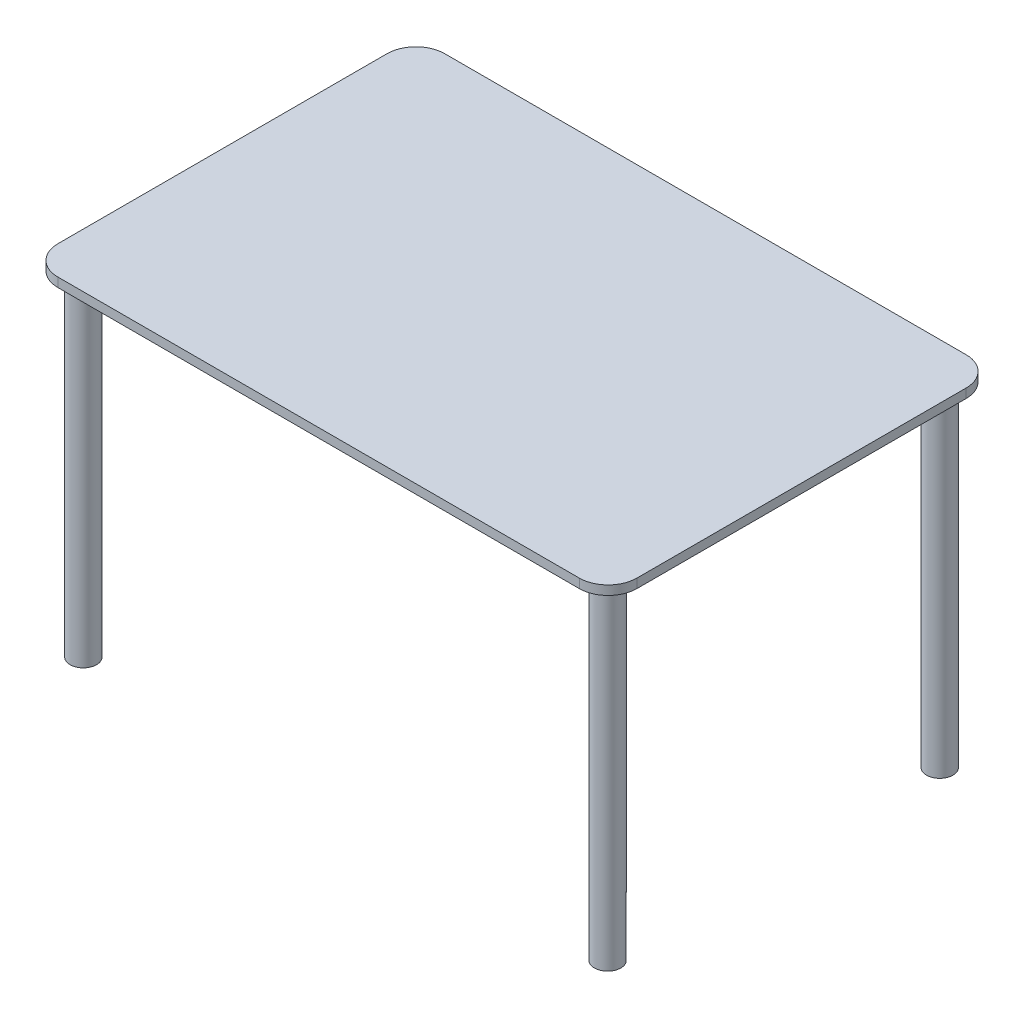
ISO-10303-21;
HEADER;
FILE_DESCRIPTION(('STEP AP214'),'2;1');
FILE_NAME('part.step','',(''),(''),'','','');
FILE_SCHEMA(('AUTOMOTIVE_DESIGN { 1 0 10303 214 1 1 1 1 }'));
ENDSEC;
DATA;
#1=APPLICATION_CONTEXT('core data for automotive mechanical design processes');
#2=APPLICATION_PROTOCOL_DEFINITION('international standard','automotive_design',2000,#1);
#3=PRODUCT_CONTEXT('',#1,'mechanical');
#4=PRODUCT('Part','Part','',(#3));
#5=PRODUCT_RELATED_PRODUCT_CATEGORY('part','',(#4));
#6=PRODUCT_DEFINITION_FORMATION('','',#4);
#7=PRODUCT_DEFINITION_CONTEXT('part definition',#1,'design');
#8=PRODUCT_DEFINITION('design','',#6,#7);
#9=PRODUCT_DEFINITION_SHAPE('','',#8);
#10=(LENGTH_UNIT() NAMED_UNIT(*) SI_UNIT(.MILLI.,.METRE.));
#11=(NAMED_UNIT(*) PLANE_ANGLE_UNIT() SI_UNIT($,.RADIAN.));
#12=(NAMED_UNIT(*) SI_UNIT($,.STERADIAN.) SOLID_ANGLE_UNIT());
#13=UNCERTAINTY_MEASURE_WITH_UNIT(LENGTH_MEASURE(1.E-05),#10,'distance_accuracy_value','');
#14=(GEOMETRIC_REPRESENTATION_CONTEXT(3) GLOBAL_UNCERTAINTY_ASSIGNED_CONTEXT((#13)) GLOBAL_UNIT_ASSIGNED_CONTEXT((#10,
#11,#12)) REPRESENTATION_CONTEXT('',''));
#15=CARTESIAN_POINT('',(0.,0.,0.));
#16=DIRECTION('',(0.,0.,1.));
#17=DIRECTION('',(1.,0.,0.));
#18=AXIS2_PLACEMENT_3D('',#15,#16,#17);
#19=CARTESIAN_POINT('',(-602.5,19.,-402.5));
#20=DIRECTION('',(0.,0.,-1.));
#21=DIRECTION('',(-1.,0.,0.));
#22=AXIS2_PLACEMENT_3D('',#19,#20,#21);
#23=PLANE('',#22);
#24=DIRECTION('',(1.,0.,0.));
#25=VECTOR('',#24,1.);
#26=CARTESIAN_POINT('',(-602.5,0.,-402.5));
#27=LINE('',#26,#25);
#28=CARTESIAN_POINT('',(-542.5,0.,-402.5));
#29=VERTEX_POINT('',#28);
#30=CARTESIAN_POINT('',(542.5,0.,-402.5));
#31=VERTEX_POINT('',#30);
#32=EDGE_CURVE('E136',#29,#31,#27,.T.);
#33=ORIENTED_EDGE('',*,*,#32,.F.);
#34=DIRECTION('',(0.,-1.,0.));
#35=VECTOR('',#34,1.);
#36=CARTESIAN_POINT('',(-542.5,19.,-402.5));
#37=LINE('',#36,#35);
#38=CARTESIAN_POINT('',(-542.5,19.,-402.5));
#39=VERTEX_POINT('',#38);
#40=EDGE_CURVE('E11',#29,#39,#37,.F.);
#41=ORIENTED_EDGE('',*,*,#40,.T.);
#42=DIRECTION('',(1.,0.,0.));
#43=VECTOR('',#42,1.);
#44=CARTESIAN_POINT('',(-602.5,19.,-402.5));
#45=LINE('',#44,#43);
#46=CARTESIAN_POINT('',(542.5,19.,-402.5));
#47=VERTEX_POINT('',#46);
#48=EDGE_CURVE('E149',#39,#47,#45,.T.);
#49=ORIENTED_EDGE('',*,*,#48,.T.);
#50=DIRECTION('',(0.,-1.,0.));
#51=VECTOR('',#50,1.);
#52=CARTESIAN_POINT('',(542.5,0.,-402.5));
#53=LINE('',#52,#51);
#54=EDGE_CURVE('E48',#47,#31,#53,.T.);
#55=ORIENTED_EDGE('',*,*,#54,.T.);
#56=EDGE_LOOP('',(#33,#41,#49,#55));
#57=FACE_BOUND('',#56,.T.);
#58=ADVANCED_FACE('F39',(#57),#23,.T.);
#59=CARTESIAN_POINT('',(-602.5,19.,402.5));
#60=DIRECTION('',(-1.,0.,0.));
#61=DIRECTION('',(0.,0.,1.));
#62=AXIS2_PLACEMENT_3D('',#59,#60,#61);
#63=PLANE('',#62);
#64=DIRECTION('',(0.,0.,-1.));
#65=VECTOR('',#64,1.);
#66=CARTESIAN_POINT('',(-602.5,0.,402.5));
#67=LINE('',#66,#65);
#68=CARTESIAN_POINT('',(-602.5,0.,342.5));
#69=VERTEX_POINT('',#68);
#70=CARTESIAN_POINT('',(-602.5,0.,-342.5));
#71=VERTEX_POINT('',#70);
#72=EDGE_CURVE('E140',#69,#71,#67,.T.);
#73=ORIENTED_EDGE('',*,*,#72,.F.);
#74=DIRECTION('',(0.,-1.,0.));
#75=VECTOR('',#74,1.);
#76=CARTESIAN_POINT('',(-602.5,19.,342.5));
#77=LINE('',#76,#75);
#78=CARTESIAN_POINT('',(-602.5,19.,342.5));
#79=VERTEX_POINT('',#78);
#80=EDGE_CURVE('E62',#69,#79,#77,.F.);
#81=ORIENTED_EDGE('',*,*,#80,.T.);
#82=DIRECTION('',(0.,0.,-1.));
#83=VECTOR('',#82,1.);
#84=CARTESIAN_POINT('',(-602.5,19.,402.5));
#85=LINE('',#84,#83);
#86=CARTESIAN_POINT('',(-602.5,19.,-342.5));
#87=VERTEX_POINT('',#86);
#88=EDGE_CURVE('E155',#79,#87,#85,.T.);
#89=ORIENTED_EDGE('',*,*,#88,.T.);
#90=DIRECTION('',(0.,-1.,0.));
#91=VECTOR('',#90,1.);
#92=CARTESIAN_POINT('',(-602.5,19.,-342.5));
#93=LINE('',#92,#91);
#94=EDGE_CURVE('E192',#87,#71,#93,.T.);
#95=ORIENTED_EDGE('',*,*,#94,.T.);
#96=EDGE_LOOP('',(#73,#81,#89,#95));
#97=FACE_BOUND('',#96,.T.);
#98=ADVANCED_FACE('F209',(#97),#63,.T.);
#99=CARTESIAN_POINT('',(-602.5,19.,402.5));
#100=DIRECTION('',(0.,0.,-1.));
#101=DIRECTION('',(-1.,0.,0.));
#102=AXIS2_PLACEMENT_3D('',#99,#100,#101);
#103=PLANE('',#102);
#104=DIRECTION('',(1.,0.,0.));
#105=VECTOR('',#104,1.);
#106=CARTESIAN_POINT('',(-602.5,0.,402.5));
#107=LINE('',#106,#105);
#108=CARTESIAN_POINT('',(-542.5,0.,402.5));
#109=VERTEX_POINT('',#108);
#110=CARTESIAN_POINT('',(542.5,0.,402.5));
#111=VERTEX_POINT('',#110);
#112=EDGE_CURVE('E135',#109,#111,#107,.T.);
#113=ORIENTED_EDGE('',*,*,#112,.T.);
#114=DIRECTION('',(0.,-1.,0.));
#115=VECTOR('',#114,1.);
#116=CARTESIAN_POINT('',(542.5,19.,402.5));
#117=LINE('',#116,#115);
#118=CARTESIAN_POINT('',(542.5,19.,402.5));
#119=VERTEX_POINT('',#118);
#120=EDGE_CURVE('E111',#111,#119,#117,.F.);
#121=ORIENTED_EDGE('',*,*,#120,.T.);
#122=DIRECTION('',(1.,0.,0.));
#123=VECTOR('',#122,1.);
#124=CARTESIAN_POINT('',(-602.5,19.,402.5));
#125=LINE('',#124,#123);
#126=CARTESIAN_POINT('',(-542.5,19.,402.5));
#127=VERTEX_POINT('',#126);
#128=EDGE_CURVE('E212',#127,#119,#125,.T.);
#129=ORIENTED_EDGE('',*,*,#128,.F.);
#130=DIRECTION('',(0.,-1.,0.));
#131=VECTOR('',#130,1.);
#132=CARTESIAN_POINT('',(-542.5,0.,402.5));
#133=LINE('',#132,#131);
#134=EDGE_CURVE('E117',#127,#109,#133,.T.);
#135=ORIENTED_EDGE('',*,*,#134,.T.);
#136=EDGE_LOOP('',(#113,#121,#129,#135));
#137=FACE_BOUND('',#136,.T.);
#138=ADVANCED_FACE('F274',(#137),#103,.F.);
#139=CARTESIAN_POINT('',(602.5,19.,402.5));
#140=DIRECTION('',(-1.,0.,0.));
#141=DIRECTION('',(0.,0.,1.));
#142=AXIS2_PLACEMENT_3D('',#139,#140,#141);
#143=PLANE('',#142);
#144=DIRECTION('',(0.,0.,-1.));
#145=VECTOR('',#144,1.);
#146=CARTESIAN_POINT('',(602.5,19.,402.5));
#147=LINE('',#146,#145);
#148=CARTESIAN_POINT('',(602.5,19.,342.5));
#149=VERTEX_POINT('',#148);
#150=CARTESIAN_POINT('',(602.5,19.,-342.5));
#151=VERTEX_POINT('',#150);
#152=EDGE_CURVE('E127',#149,#151,#147,.T.);
#153=ORIENTED_EDGE('',*,*,#152,.F.);
#154=DIRECTION('',(0.,-1.,0.));
#155=VECTOR('',#154,1.);
#156=CARTESIAN_POINT('',(602.5,19.,342.5));
#157=LINE('',#156,#155);
#158=CARTESIAN_POINT('',(602.5,0.,342.5));
#159=VERTEX_POINT('',#158);
#160=EDGE_CURVE('E110',#149,#159,#157,.T.);
#161=ORIENTED_EDGE('',*,*,#160,.T.);
#162=DIRECTION('',(0.,0.,-1.));
#163=VECTOR('',#162,1.);
#164=CARTESIAN_POINT('',(602.5,0.,402.5));
#165=LINE('',#164,#163);
#166=CARTESIAN_POINT('',(602.5,0.,-342.5));
#167=VERTEX_POINT('',#166);
#168=EDGE_CURVE('E124',#159,#167,#165,.T.);
#169=ORIENTED_EDGE('',*,*,#168,.T.);
#170=DIRECTION('',(0.,-1.,0.));
#171=VECTOR('',#170,1.);
#172=CARTESIAN_POINT('',(602.5,19.,-342.5));
#173=LINE('',#172,#171);
#174=EDGE_CURVE('E130',#167,#151,#173,.F.);
#175=ORIENTED_EDGE('',*,*,#174,.T.);
#176=EDGE_LOOP('',(#153,#161,#169,#175));
#177=FACE_BOUND('',#176,.T.);
#178=ADVANCED_FACE('F123',(#177),#143,.F.);
#179=CARTESIAN_POINT('',(0.,19.,0.));
#180=DIRECTION('',(0.,1.,0.));
#181=DIRECTION('',(0.,0.,1.));
#182=AXIS2_PLACEMENT_3D('',#179,#180,#181);
#183=PLANE('',#182);
#184=ORIENTED_EDGE('',*,*,#128,.T.);
#185=CARTESIAN_POINT('',(542.5,19.,342.5));
#186=DIRECTION('',(0.,1.,0.));
#187=DIRECTION('',(0.,0.,1.));
#188=AXIS2_PLACEMENT_3D('',#185,#186,#187);
#189=CIRCLE('',#188,60.);
#190=EDGE_CURVE('E189',#119,#149,#189,.T.);
#191=ORIENTED_EDGE('',*,*,#190,.T.);
#192=ORIENTED_EDGE('',*,*,#152,.T.);
#193=CARTESIAN_POINT('',(542.5,19.,-342.5));
#194=DIRECTION('',(0.,1.,0.));
#195=DIRECTION('',(0.,0.,1.));
#196=AXIS2_PLACEMENT_3D('',#193,#194,#195);
#197=CIRCLE('',#196,60.);
#198=EDGE_CURVE('E181',#151,#47,#197,.T.);
#199=ORIENTED_EDGE('',*,*,#198,.T.);
#200=ORIENTED_EDGE('',*,*,#48,.F.);
#201=CARTESIAN_POINT('',(-542.5,19.,-342.5));
#202=DIRECTION('',(0.,1.,0.));
#203=DIRECTION('',(0.,0.,1.));
#204=AXIS2_PLACEMENT_3D('',#201,#202,#203);
#205=CIRCLE('',#204,60.);
#206=EDGE_CURVE('E55',#39,#87,#205,.T.);
#207=ORIENTED_EDGE('',*,*,#206,.T.);
#208=ORIENTED_EDGE('',*,*,#88,.F.);
#209=CARTESIAN_POINT('',(-542.5,19.,342.5));
#210=DIRECTION('',(0.,1.,0.));
#211=DIRECTION('',(0.,0.,1.));
#212=AXIS2_PLACEMENT_3D('',#209,#210,#211);
#213=CIRCLE('',#212,60.);
#214=EDGE_CURVE('E186',#79,#127,#213,.T.);
#215=ORIENTED_EDGE('',*,*,#214,.T.);
#216=EDGE_LOOP('',(#184,#191,#192,#199,#200,#207,#208,#215));
#217=FACE_BOUND('',#216,.T.);
#218=ADVANCED_FACE('F249',(#217),#183,.T.);
#219=CARTESIAN_POINT('',(0.,0.,0.));
#220=DIRECTION('',(0.,1.,0.));
#221=DIRECTION('',(0.,0.,1.));
#222=AXIS2_PLACEMENT_3D('',#219,#220,#221);
#223=PLANE('',#222);
#224=CARTESIAN_POINT('',(-546.,0.,-346.));
#225=DIRECTION('',(0.,1.,0.));
#226=DIRECTION('',(0.,0.,1.));
#227=AXIS2_PLACEMENT_3D('',#224,#225,#226);
#228=CIRCLE('',#227,27.5);
#229=CARTESIAN_POINT('',(-546.,0.,-318.5));
#230=VERTEX_POINT('',#229);
#231=EDGE_CURVE('E163',#230,#230,#228,.F.);
#232=ORIENTED_EDGE('',*,*,#231,.F.);
#233=EDGE_LOOP('',(#232));
#234=FACE_BOUND('',#233,.T.);
#235=CARTESIAN_POINT('',(544.120521211834,0.,-346.));
#236=DIRECTION('',(0.,1.,0.));
#237=DIRECTION('',(0.,0.,1.));
#238=AXIS2_PLACEMENT_3D('',#235,#236,#237);
#239=CIRCLE('',#238,27.4999999999999);
#240=CARTESIAN_POINT('',(544.120521211834,0.,-318.5));
#241=VERTEX_POINT('',#240);
#242=EDGE_CURVE('E159',#241,#241,#239,.F.);
#243=ORIENTED_EDGE('',*,*,#242,.F.);
#244=EDGE_LOOP('',(#243));
#245=FACE_BOUND('',#244,.T.);
#246=CARTESIAN_POINT('',(546.,0.,347.089225584359));
#247=DIRECTION('',(0.,1.,0.));
#248=DIRECTION('',(0.,0.,1.));
#249=AXIS2_PLACEMENT_3D('',#246,#247,#248);
#250=CIRCLE('',#249,27.4999999999999);
#251=CARTESIAN_POINT('',(546.,0.,374.589225584359));
#252=VERTEX_POINT('',#251);
#253=EDGE_CURVE('E154',#252,#252,#250,.F.);
#254=ORIENTED_EDGE('',*,*,#253,.F.);
#255=EDGE_LOOP('',(#254));
#256=FACE_BOUND('',#255,.T.);
#257=CARTESIAN_POINT('',(-546.,0.,346.));
#258=DIRECTION('',(0.,1.,0.));
#259=DIRECTION('',(0.,0.,1.));
#260=AXIS2_PLACEMENT_3D('',#257,#258,#259);
#261=CIRCLE('',#260,27.5);
#262=CARTESIAN_POINT('',(-546.,0.,373.5));
#263=VERTEX_POINT('',#262);
#264=EDGE_CURVE('E150',#263,#263,#261,.F.);
#265=ORIENTED_EDGE('',*,*,#264,.F.);
#266=EDGE_LOOP('',(#265));
#267=FACE_BOUND('',#266,.T.);
#268=ORIENTED_EDGE('',*,*,#168,.F.);
#269=CARTESIAN_POINT('',(542.5,0.,342.5));
#270=DIRECTION('',(0.,1.,0.));
#271=DIRECTION('',(0.,0.,1.));
#272=AXIS2_PLACEMENT_3D('',#269,#270,#271);
#273=CIRCLE('',#272,60.);
#274=EDGE_CURVE('E106',#159,#111,#273,.F.);
#275=ORIENTED_EDGE('',*,*,#274,.T.);
#276=ORIENTED_EDGE('',*,*,#112,.F.);
#277=CARTESIAN_POINT('',(-542.5,0.,342.5));
#278=DIRECTION('',(0.,1.,0.));
#279=DIRECTION('',(0.,0.,1.));
#280=AXIS2_PLACEMENT_3D('',#277,#278,#279);
#281=CIRCLE('',#280,60.);
#282=EDGE_CURVE('E118',#109,#69,#281,.F.);
#283=ORIENTED_EDGE('',*,*,#282,.T.);
#284=ORIENTED_EDGE('',*,*,#72,.T.);
#285=CARTESIAN_POINT('',(-542.5,0.,-342.5));
#286=DIRECTION('',(0.,1.,0.));
#287=DIRECTION('',(0.,0.,1.));
#288=AXIS2_PLACEMENT_3D('',#285,#286,#287);
#289=CIRCLE('',#288,60.);
#290=EDGE_CURVE('E171',#71,#29,#289,.F.);
#291=ORIENTED_EDGE('',*,*,#290,.T.);
#292=ORIENTED_EDGE('',*,*,#32,.T.);
#293=CARTESIAN_POINT('',(542.5,0.,-342.5));
#294=DIRECTION('',(0.,1.,0.));
#295=DIRECTION('',(0.,0.,1.));
#296=AXIS2_PLACEMENT_3D('',#293,#294,#295);
#297=CIRCLE('',#296,60.);
#298=EDGE_CURVE('E129',#31,#167,#297,.F.);
#299=ORIENTED_EDGE('',*,*,#298,.T.);
#300=EDGE_LOOP('',(#268,#275,#276,#283,#284,#291,#292,#299));
#301=FACE_BOUND('',#300,.T.);
#302=ADVANCED_FACE('F132',(#234,#245,#256,#267,#301),#223,.F.);
#303=CARTESIAN_POINT('',(-546.,-696.,346.));
#304=DIRECTION('',(0.,1.,0.));
#305=DIRECTION('',(0.,0.,1.));
#306=AXIS2_PLACEMENT_3D('',#303,#304,#305);
#307=CYLINDRICAL_SURFACE('',#306,27.5);
#308=CARTESIAN_POINT('',(-546.,-696.,346.));
#309=DIRECTION('',(0.,-1.,0.));
#310=DIRECTION('',(0.,0.,-1.));
#311=AXIS2_PLACEMENT_3D('',#308,#309,#310);
#312=CIRCLE('',#311,27.5);
#313=CARTESIAN_POINT('',(-546.,-696.,318.5));
#314=VERTEX_POINT('',#313);
#315=EDGE_CURVE('E142',#314,#314,#312,.T.);
#316=ORIENTED_EDGE('',*,*,#315,.F.);
#317=EDGE_LOOP('',(#316));
#318=FACE_BOUND('',#317,.T.);
#319=ORIENTED_EDGE('',*,*,#264,.T.);
#320=EDGE_LOOP('',(#319));
#321=FACE_BOUND('',#320,.T.);
#322=ADVANCED_FACE('F248',(#318,#321),#307,.T.);
#323=CARTESIAN_POINT('',(-546.,-696.,346.));
#324=DIRECTION('',(0.,-1.,0.));
#325=DIRECTION('',(0.,0.,-1.));
#326=AXIS2_PLACEMENT_3D('',#323,#324,#325);
#327=PLANE('',#326);
#328=ORIENTED_EDGE('',*,*,#315,.T.);
#329=EDGE_LOOP('',(#328));
#330=FACE_BOUND('',#329,.T.);
#331=ADVANCED_FACE('F258',(#330),#327,.T.);
#332=CARTESIAN_POINT('',(546.,-696.,347.089225584359));
#333=DIRECTION('',(0.,1.,0.));
#334=DIRECTION('',(0.,0.,1.));
#335=AXIS2_PLACEMENT_3D('',#332,#333,#334);
#336=CYLINDRICAL_SURFACE('',#335,27.4999999999999);
#337=CARTESIAN_POINT('',(546.,-696.,347.089225584359));
#338=DIRECTION('',(0.,-1.,0.));
#339=DIRECTION('',(0.,0.,-1.));
#340=AXIS2_PLACEMENT_3D('',#337,#338,#339);
#341=CIRCLE('',#340,27.4999999999999);
#342=CARTESIAN_POINT('',(546.,-696.,319.589225584359));
#343=VERTEX_POINT('',#342);
#344=EDGE_CURVE('E224',#343,#343,#341,.T.);
#345=ORIENTED_EDGE('',*,*,#344,.F.);
#346=EDGE_LOOP('',(#345));
#347=FACE_BOUND('',#346,.T.);
#348=ORIENTED_EDGE('',*,*,#253,.T.);
#349=EDGE_LOOP('',(#348));
#350=FACE_BOUND('',#349,.T.);
#351=ADVANCED_FACE('F264',(#347,#350),#336,.T.);
#352=CARTESIAN_POINT('',(546.,-696.,347.089225584359));
#353=DIRECTION('',(0.,-1.,0.));
#354=DIRECTION('',(0.,0.,-1.));
#355=AXIS2_PLACEMENT_3D('',#352,#353,#354);
#356=PLANE('',#355);
#357=ORIENTED_EDGE('',*,*,#344,.T.);
#358=EDGE_LOOP('',(#357));
#359=FACE_BOUND('',#358,.T.);
#360=ADVANCED_FACE('F353',(#359),#356,.T.);
#361=CARTESIAN_POINT('',(544.120521211834,-696.,-346.));
#362=DIRECTION('',(0.,1.,0.));
#363=DIRECTION('',(0.,0.,1.));
#364=AXIS2_PLACEMENT_3D('',#361,#362,#363);
#365=CYLINDRICAL_SURFACE('',#364,27.4999999999999);
#366=CARTESIAN_POINT('',(544.120521211834,-696.,-346.));
#367=DIRECTION('',(0.,-1.,0.));
#368=DIRECTION('',(0.,0.,-1.));
#369=AXIS2_PLACEMENT_3D('',#366,#367,#368);
#370=CIRCLE('',#369,27.4999999999999);
#371=CARTESIAN_POINT('',(544.120521211834,-696.,-373.5));
#372=VERTEX_POINT('',#371);
#373=EDGE_CURVE('E228',#372,#372,#370,.T.);
#374=ORIENTED_EDGE('',*,*,#373,.F.);
#375=EDGE_LOOP('',(#374));
#376=FACE_BOUND('',#375,.T.);
#377=ORIENTED_EDGE('',*,*,#242,.T.);
#378=EDGE_LOOP('',(#377));
#379=FACE_BOUND('',#378,.T.);
#380=ADVANCED_FACE('F345',(#376,#379),#365,.T.);
#381=CARTESIAN_POINT('',(544.120521211834,-696.,-346.));
#382=DIRECTION('',(0.,-1.,0.));
#383=DIRECTION('',(0.,0.,-1.));
#384=AXIS2_PLACEMENT_3D('',#381,#382,#383);
#385=PLANE('',#384);
#386=ORIENTED_EDGE('',*,*,#373,.T.);
#387=EDGE_LOOP('',(#386));
#388=FACE_BOUND('',#387,.T.);
#389=ADVANCED_FACE('F242',(#388),#385,.T.);
#390=CARTESIAN_POINT('',(-546.,-696.,-346.));
#391=DIRECTION('',(0.,1.,0.));
#392=DIRECTION('',(0.,0.,1.));
#393=AXIS2_PLACEMENT_3D('',#390,#391,#392);
#394=CYLINDRICAL_SURFACE('',#393,27.5);
#395=CARTESIAN_POINT('',(-546.,-696.,-346.));
#396=DIRECTION('',(0.,-1.,0.));
#397=DIRECTION('',(0.,0.,-1.));
#398=AXIS2_PLACEMENT_3D('',#395,#396,#397);
#399=CIRCLE('',#398,27.5);
#400=CARTESIAN_POINT('',(-546.,-696.,-373.5));
#401=VERTEX_POINT('',#400);
#402=EDGE_CURVE('E232',#401,#401,#399,.T.);
#403=ORIENTED_EDGE('',*,*,#402,.F.);
#404=EDGE_LOOP('',(#403));
#405=FACE_BOUND('',#404,.T.);
#406=ORIENTED_EDGE('',*,*,#231,.T.);
#407=EDGE_LOOP('',(#406));
#408=FACE_BOUND('',#407,.T.);
#409=ADVANCED_FACE('F239',(#405,#408),#394,.T.);
#410=CARTESIAN_POINT('',(-546.,-696.,-346.));
#411=DIRECTION('',(0.,-1.,0.));
#412=DIRECTION('',(0.,0.,-1.));
#413=AXIS2_PLACEMENT_3D('',#410,#411,#412);
#414=PLANE('',#413);
#415=ORIENTED_EDGE('',*,*,#402,.T.);
#416=EDGE_LOOP('',(#415));
#417=FACE_BOUND('',#416,.T.);
#418=ADVANCED_FACE('F237',(#417),#414,.T.);
#419=CARTESIAN_POINT('',(542.5,19.,342.5));
#420=DIRECTION('',(0.,-1.,0.));
#421=DIRECTION('',(0.,0.,-1.));
#422=AXIS2_PLACEMENT_3D('',#419,#420,#421);
#423=CYLINDRICAL_SURFACE('',#422,60.);
#424=ORIENTED_EDGE('',*,*,#190,.F.);
#425=ORIENTED_EDGE('',*,*,#120,.F.);
#426=ORIENTED_EDGE('',*,*,#274,.F.);
#427=ORIENTED_EDGE('',*,*,#160,.F.);
#428=EDGE_LOOP('',(#424,#425,#426,#427));
#429=FACE_BOUND('',#428,.T.);
#430=ADVANCED_FACE('F109',(#429),#423,.T.);
#431=CARTESIAN_POINT('',(-542.5,19.,342.5));
#432=DIRECTION('',(0.,1.,0.));
#433=DIRECTION('',(0.,0.,1.));
#434=AXIS2_PLACEMENT_3D('',#431,#432,#433);
#435=CYLINDRICAL_SURFACE('',#434,60.);
#436=ORIENTED_EDGE('',*,*,#214,.F.);
#437=ORIENTED_EDGE('',*,*,#80,.F.);
#438=ORIENTED_EDGE('',*,*,#282,.F.);
#439=ORIENTED_EDGE('',*,*,#134,.F.);
#440=EDGE_LOOP('',(#436,#437,#438,#439));
#441=FACE_BOUND('',#440,.T.);
#442=ADVANCED_FACE('F281',(#441),#435,.T.);
#443=CARTESIAN_POINT('',(-542.5,19.,-342.5));
#444=DIRECTION('',(0.,-1.,0.));
#445=DIRECTION('',(0.,0.,-1.));
#446=AXIS2_PLACEMENT_3D('',#443,#444,#445);
#447=CYLINDRICAL_SURFACE('',#446,60.);
#448=ORIENTED_EDGE('',*,*,#206,.F.);
#449=ORIENTED_EDGE('',*,*,#40,.F.);
#450=ORIENTED_EDGE('',*,*,#290,.F.);
#451=ORIENTED_EDGE('',*,*,#94,.F.);
#452=EDGE_LOOP('',(#448,#449,#450,#451));
#453=FACE_BOUND('',#452,.T.);
#454=ADVANCED_FACE('F208',(#453),#447,.T.);
#455=CARTESIAN_POINT('',(542.5,19.,-342.5));
#456=DIRECTION('',(0.,1.,0.));
#457=DIRECTION('',(0.,0.,1.));
#458=AXIS2_PLACEMENT_3D('',#455,#456,#457);
#459=CYLINDRICAL_SURFACE('',#458,60.);
#460=ORIENTED_EDGE('',*,*,#198,.F.);
#461=ORIENTED_EDGE('',*,*,#174,.F.);
#462=ORIENTED_EDGE('',*,*,#298,.F.);
#463=ORIENTED_EDGE('',*,*,#54,.F.);
#464=EDGE_LOOP('',(#460,#461,#462,#463));
#465=FACE_BOUND('',#464,.T.);
#466=ADVANCED_FACE('F41',(#465),#459,.T.);
#467=CLOSED_SHELL('',(#58,#98,#138,#178,#218,#302,#322,#331,#351,#360,#380,#389,#409,#418,#430,
#442,#454,#466));
#468=MANIFOLD_SOLID_BREP('B2',#467);
#469=ADVANCED_BREP_SHAPE_REPRESENTATION('',(#18,#468),#14);
#470=SHAPE_DEFINITION_REPRESENTATION(#9,#469);
ENDSEC;
END-ISO-10303-21;
